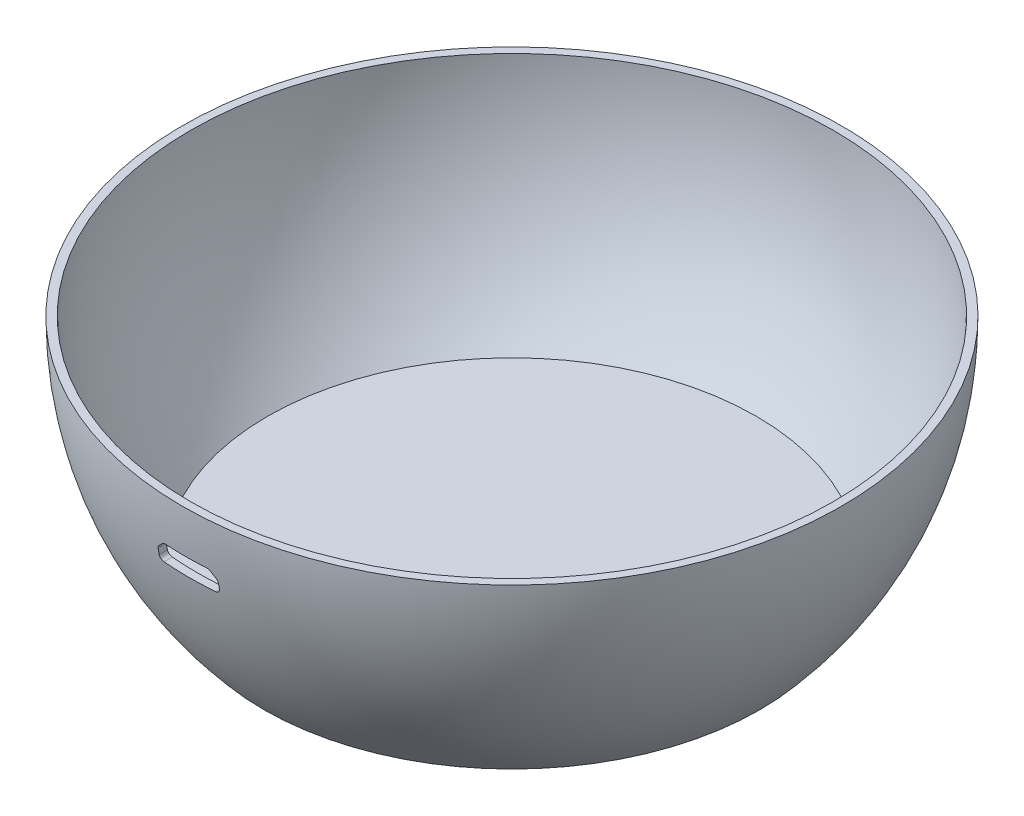
ISO-10303-21;
HEADER;
FILE_DESCRIPTION(('STEP AP214'),'2;1');
FILE_NAME('part.step','',(''),(''),'','','');
FILE_SCHEMA(('AUTOMOTIVE_DESIGN { 1 0 10303 214 1 1 1 1 }'));
ENDSEC;
DATA;
#1=APPLICATION_CONTEXT('core data for automotive mechanical design processes');
#2=APPLICATION_PROTOCOL_DEFINITION('international standard','automotive_design',2000,#1);
#3=PRODUCT_CONTEXT('',#1,'mechanical');
#4=PRODUCT('Part','Part','',(#3));
#5=PRODUCT_RELATED_PRODUCT_CATEGORY('part','',(#4));
#6=PRODUCT_DEFINITION_FORMATION('','',#4);
#7=PRODUCT_DEFINITION_CONTEXT('part definition',#1,'design');
#8=PRODUCT_DEFINITION('design','',#6,#7);
#9=PRODUCT_DEFINITION_SHAPE('','',#8);
#10=(LENGTH_UNIT() NAMED_UNIT(*) SI_UNIT(.MILLI.,.METRE.));
#11=(NAMED_UNIT(*) PLANE_ANGLE_UNIT() SI_UNIT($,.RADIAN.));
#12=(NAMED_UNIT(*) SI_UNIT($,.STERADIAN.) SOLID_ANGLE_UNIT());
#13=UNCERTAINTY_MEASURE_WITH_UNIT(LENGTH_MEASURE(1.E-05),#10,'distance_accuracy_value','');
#14=(GEOMETRIC_REPRESENTATION_CONTEXT(3) GLOBAL_UNCERTAINTY_ASSIGNED_CONTEXT((#13)) GLOBAL_UNIT_ASSIGNED_CONTEXT((#10,
#11,#12)) REPRESENTATION_CONTEXT('',''));
#15=CARTESIAN_POINT('',(0.,0.,0.));
#16=DIRECTION('',(0.,0.,1.));
#17=DIRECTION('',(1.,0.,0.));
#18=AXIS2_PLACEMENT_3D('',#15,#16,#17);
#19=CARTESIAN_POINT('',(41.,0.,0.));
#20=DIRECTION('',(0.,1.,0.));
#21=DIRECTION('',(-1.,0.,0.));
#22=AXIS2_PLACEMENT_3D('',#19,#20,#21);
#23=SPHERICAL_SURFACE('',#22,41.);
#24=CARTESIAN_POINT('',(41.,-27.,0.));
#25=DIRECTION('',(0.,1.,0.));
#26=DIRECTION('',(0.,0.,1.));
#27=AXIS2_PLACEMENT_3D('',#24,#25,#26);
#28=CIRCLE('',#27,30.854497241083);
#29=CARTESIAN_POINT('',(41.,-27.,30.854497241083));
#30=VERTEX_POINT('',#29);
#31=EDGE_CURVE('E363',#30,#30,#28,.T.);
#32=ORIENTED_EDGE('',*,*,#31,.T.);
#33=EDGE_LOOP('',(#32));
#34=FACE_BOUND('',#33,.T.);
#35=CARTESIAN_POINT('',(41.,0.,0.));
#36=DIRECTION('',(0.,1.,0.));
#37=DIRECTION('',(0.,0.,1.));
#38=AXIS2_PLACEMENT_3D('',#35,#36,#37);
#39=CIRCLE('',#38,41.);
#40=CARTESIAN_POINT('',(41.,0.,41.));
#41=VERTEX_POINT('',#40);
#42=EDGE_CURVE('E366',#41,#41,#39,.T.);
#43=ORIENTED_EDGE('',*,*,#42,.F.);
#44=EDGE_LOOP('',(#43));
#45=FACE_BOUND('',#44,.T.);
#46=CARTESIAN_POINT('',(41.,-8.05000000000004,0.));
#47=DIRECTION('',(0.,1.,0.));
#48=DIRECTION('',(0.,0.,1.));
#49=AXIS2_PLACEMENT_3D('',#46,#47,#48);
#50=CIRCLE('',#49,40.201958907496);
#51=CARTESIAN_POINT('',(44.2,-8.05000000000004,40.0743995588206));
#52=VERTEX_POINT('',#51);
#53=CARTESIAN_POINT('',(37.8,-8.05000000000004,40.0743995588206));
#54=VERTEX_POINT('',#53);
#55=EDGE_CURVE('E151',#52,#54,#50,.F.);
#56=ORIENTED_EDGE('',*,*,#55,.T.);
#57=CARTESIAN_POINT('',(37.8002,-8.0499999636364,40.0744155359184));
#58=CARTESIAN_POINT('',(37.7699003872346,-8.05003927033095,40.0719886759873));
#59=CARTESIAN_POINT('',(37.7395654459079,-8.04751966404724,40.0700377498065));
#60=CARTESIAN_POINT('',(37.6796967025583,-8.03753049269013,40.0671262314842));
#61=CARTESIAN_POINT('',(37.6501622961585,-8.03006477660709,40.0661648707617));
#62=CARTESIAN_POINT('',(37.5926974192663,-8.01034419126982,40.0652667607826));
#63=CARTESIAN_POINT('',(37.5647680376586,-7.99808611375659,40.065330699065));
#64=CARTESIAN_POINT('',(37.5113375258054,-7.96914427226676,40.0664809593562));
#65=CARTESIAN_POINT('',(37.4858358657683,-7.9524614769006,40.0675670577373));
#66=CARTESIAN_POINT('',(37.4380163424505,-7.9151929279918,40.0707238905891));
#67=CARTESIAN_POINT('',(37.4156923778877,-7.89461483559452,40.072792704144));
#68=CARTESIAN_POINT('',(37.3747693799187,-7.85013199014316,40.0778498742404));
#69=CARTESIAN_POINT('',(37.3561709913952,-7.82622666236918,40.0808383897522));
#70=CARTESIAN_POINT('',(37.3230273252335,-7.77554102192634,40.0876760527914));
#71=CARTESIAN_POINT('',(37.3085220231873,-7.74873566840783,40.0915330687485));
#72=CARTESIAN_POINT('',(37.2841577634807,-7.69319870225463,40.0999768943745));
#73=CARTESIAN_POINT('',(37.2742980399401,-7.66446740802749,40.1045635835808));
#74=CARTESIAN_POINT('',(37.2612506157921,-7.61301580676833,40.1131434877442));
#75=CARTESIAN_POINT('',(37.2570238596645,-7.59053121811446,40.1170101116611));
#76=CARTESIAN_POINT('',(37.2513938533629,-7.54529259469726,40.125017731459));
#77=CARTESIAN_POINT('',(37.2499866105246,-7.52253898691445,40.1291583307665));
#78=CARTESIAN_POINT('',(37.2500000363636,-7.49980000000001,40.1334087791297));
#79=B_SPLINE_CURVE_WITH_KNOTS('',3,(#57,#58,#59,#60,#61,#62,#63,#64,#65,#66,#67,#68,#69,#70,#71,
#72,#73,#74,#75,#76,#77,#78),.UNSPECIFIED.,.F.,.F.,(4,2,2,2,2,2,2,2,2,2,4),(0.,
0.0910756737535569,0.182080556866536,0.27314646804892,0.364192460516308,0.455061212949634,
0.545945680845675,0.637689271313235,0.729417731435952,0.798858089795699,0.868200045160609),.UNSPECIFIED.);
#80=CARTESIAN_POINT('',(37.25,-7.50000000000001,40.1333714008679));
#81=VERTEX_POINT('',#80);
#82=EDGE_CURVE('E143',#54,#81,#79,.T.);
#83=ORIENTED_EDGE('',*,*,#82,.T.);
#84=CARTESIAN_POINT('',(37.25,0.,0.));
#85=DIRECTION('',(1.,0.,0.));
#86=DIRECTION('',(0.,0.,-1.));
#87=AXIS2_PLACEMENT_3D('',#84,#85,#86);
#88=CIRCLE('',#87,40.8281459290034);
#89=CARTESIAN_POINT('',(37.25,-6.75355338866211,40.2657052170515));
#90=VERTEX_POINT('',#89);
#91=EDGE_CURVE('E131',#81,#90,#88,.F.);
#92=ORIENTED_EDGE('',*,*,#91,.T.);
#93=CARTESIAN_POINT('',(37.2500000363636,-6.75375338866211,40.2656716749872));
#94=CARTESIAN_POINT('',(37.2499634855906,-6.72229697884157,40.2709448389459));
#95=CARTESIAN_POINT('',(37.2526737931118,-6.6908862353088,40.2764275156635));
#96=CARTESIAN_POINT('',(37.2633766203348,-6.62899532754217,40.2876541457646));
#97=CARTESIAN_POINT('',(37.2713736849618,-6.59851598762657,40.2933983199927));
#98=CARTESIAN_POINT('',(37.2924429677611,-6.53936989039266,40.3049833752062));
#99=CARTESIAN_POINT('',(37.3055176529426,-6.51070402205149,40.3108243018771));
#100=CARTESIAN_POINT('',(37.3363421689391,-6.45606266603959,40.3224240193953));
#101=CARTESIAN_POINT('',(37.3540817361135,-6.43008144431934,40.3281829616562));
#102=CARTESIAN_POINT('',(37.3856509342431,-6.3913881029512,40.3371664765541));
#103=CARTESIAN_POINT('',(37.3981335658757,-6.37757907384953,40.3404686151327));
#104=CARTESIAN_POINT('',(37.4112912703474,-6.36444476374105,40.3437109411492));
#105=B_SPLINE_CURVE_WITH_KNOTS('',3,(#93,#94,#95,#96,#97,#98,#99,#100,#101,#102,#103,#104),
.UNSPECIFIED.,.F.,.F.,(4,2,2,2,2,4),(0.,0.0955538810140487,0.191190014903938,0.286872672750666,
0.382346546537081,0.438964350776908),.UNSPECIFIED.);
#106=CARTESIAN_POINT('',(37.4110912703474,-6.36464466094061,40.3436616145608));
#107=VERTEX_POINT('',#106);
#108=EDGE_CURVE('E137',#90,#107,#105,.T.);
#109=ORIENTED_EDGE('',*,*,#108,.T.);
#110=CARTESIAN_POINT('',(42.387867965644,-1.387867965644,0.));
#111=DIRECTION('',(0.707106781186548,-0.707106781186547,0.));
#112=DIRECTION('',(0.707106781186547,0.707106781186548,0.));
#113=AXIS2_PLACEMENT_3D('',#110,#111,#112);
#114=CIRCLE('',#113,40.9529931142997);
#115=CARTESIAN_POINT('',(38.0146446609406,-5.76109127034741,40.4832987894302));
#116=VERTEX_POINT('',#115);
#117=EDGE_CURVE('E291',#107,#116,#114,.F.);
#118=ORIENTED_EDGE('',*,*,#117,.T.);
#119=CARTESIAN_POINT('',(38.0144446609406,-5.76129137325223,40.4832555636266));
#120=CARTESIAN_POINT('',(38.0362805035121,-5.7393949171051,40.4879824483503));
#121=CARTESIAN_POINT('',(38.0600161259931,-5.71936072479655,40.4925474023299));
#122=CARTESIAN_POINT('',(38.1105939624342,-5.68349272079399,40.5012372161063));
#123=CARTESIAN_POINT('',(38.1374402771385,-5.66766454636847,40.5053614808737));
#124=CARTESIAN_POINT('',(38.1935122165427,-5.64073215551732,40.5130442329548));
#125=CARTESIAN_POINT('',(38.2227401754652,-5.62963264158155,40.5166021548685));
#126=CARTESIAN_POINT('',(38.2826750991061,-5.61254778446806,40.52303578879));
#127=CARTESIAN_POINT('',(38.3133784241999,-5.60655047630228,40.5259130853921));
#128=CARTESIAN_POINT('',(38.3542197014463,-5.60212661564787,40.5292008763934));
#129=CARTESIAN_POINT('',(38.364111277904,-5.6013260462963,40.5299560383406));
#130=CARTESIAN_POINT('',(38.3839174823874,-5.60026155923667,40.5313863710729));
#131=CARTESIAN_POINT('',(38.393832070418,-5.59999702072795,40.5320616335384));
#132=CARTESIAN_POINT('',(38.4037533905932,-5.60000003636364,40.5326967167973));
#133=B_SPLINE_CURVE_WITH_KNOTS('',3,(#119,#120,#121,#122,#123,#124,#125,#126,#127,#128,#129,
#130,#131,#132),.UNSPECIFIED.,.F.,.F.,(4,2,2,2,2,2,4),(0.,0.0937391784444169,0.187603367684721,
0.281560684957384,0.375297054343548,0.405144355238499,0.434957068871828),.UNSPECIFIED.);
#134=CARTESIAN_POINT('',(38.4035533905932,-5.60000000000001,40.5326839106973));
#135=VERTEX_POINT('',#134);
#136=EDGE_CURVE('E283',#116,#135,#133,.T.);
#137=ORIENTED_EDGE('',*,*,#136,.T.);
#138=CARTESIAN_POINT('',(41.,-5.60000000000001,0.));
#139=DIRECTION('',(0.,-1.,0.));
#140=DIRECTION('',(0.,0.,-1.));
#141=AXIS2_PLACEMENT_3D('',#138,#139,#140);
#142=CIRCLE('',#141,40.6157604877713);
#143=CARTESIAN_POINT('',(43.5964466094068,-5.60000000000001,40.5326839106973));
#144=VERTEX_POINT('',#143);
#145=EDGE_CURVE('E279',#135,#144,#142,.F.);
#146=ORIENTED_EDGE('',*,*,#145,.T.);
#147=CARTESIAN_POINT('',(43.5962466094068,-5.60000003636364,40.5326967167973));
#148=CARTESIAN_POINT('',(43.6271758240302,-5.59996097763576,40.5307213701466));
#149=CARTESIAN_POINT('',(43.6580681745533,-5.60258428373273,40.5283442977183));
#150=CARTESIAN_POINT('',(43.7189258241249,-5.61293109130712,40.5228750061427));
#151=CARTESIAN_POINT('',(43.7488910626392,-5.62065492508332,40.5197827404093));
#152=CARTESIAN_POINT('',(43.8070474097332,-5.64098186960747,40.5129704177915));
#153=CARTESIAN_POINT('',(43.8352378737688,-5.65358674125126,40.5092501346155));
#154=CARTESIAN_POINT('',(43.8890307940233,-5.6832724891185,40.5012946794562));
#155=CARTESIAN_POINT('',(43.9146376753362,-5.70034552566158,40.4970604161927));
#156=CARTESIAN_POINT('',(43.9468296283883,-5.72592114773363,40.4911118101072));
#157=CARTESIAN_POINT('',(43.9548664943422,-5.73269221380947,40.489568002625));
#158=CARTESIAN_POINT('',(43.9705237507168,-5.74666894499008,40.4864409002204));
#159=CARTESIAN_POINT('',(43.9781447228812,-5.75387397175067,40.4848576652142));
#160=CARTESIAN_POINT('',(43.9855553390594,-5.76129137325224,40.4832555636266));
#161=B_SPLINE_CURVE_WITH_KNOTS('',3,(#147,#148,#149,#150,#151,#152,#153,#154,#155,#156,#157,
#158,#159,#160),.UNSPECIFIED.,.F.,.F.,(4,2,2,2,2,2,4),(0.,0.0928458685862995,0.185697786666968,
0.278583233500037,0.371306786955016,0.403159509972959,0.434966471618371),.UNSPECIFIED.);
#162=CARTESIAN_POINT('',(43.9853553390594,-5.76109127034741,40.4832987894302));
#163=VERTEX_POINT('',#162);
#164=EDGE_CURVE('E271',#144,#163,#161,.T.);
#165=ORIENTED_EDGE('',*,*,#164,.T.);
#166=CARTESIAN_POINT('',(39.612132034356,-1.387867965644,0.));
#167=DIRECTION('',(-0.707106781186548,-0.707106781186547,0.));
#168=DIRECTION('',(0.707106781186547,-0.707106781186548,0.));
#169=AXIS2_PLACEMENT_3D('',#166,#167,#168);
#170=CIRCLE('',#169,40.9529931142997);
#171=CARTESIAN_POINT('',(44.5889087296526,-6.36464466094061,40.3436616145608));
#172=VERTEX_POINT('',#171);
#173=EDGE_CURVE('E253',#163,#172,#170,.F.);
#174=ORIENTED_EDGE('',*,*,#173,.T.);
#175=CARTESIAN_POINT('',(44.5887087296526,-6.36444476374106,40.3437109411492));
#176=CARTESIAN_POINT('',(44.6109809542131,-6.38665870125118,40.3382257715706));
#177=CARTESIAN_POINT('',(44.6312844000374,-6.41078841558891,40.332574844841));
#178=CARTESIAN_POINT('',(44.6675056965239,-6.46214461266667,40.3210999542107));
#179=CARTESIAN_POINT('',(44.6834190889391,-6.48937420409453,40.3152758210117));
#180=CARTESIAN_POINT('',(44.710372847714,-6.54616329097255,40.3036214861078));
#181=CARTESIAN_POINT('',(44.7214104705602,-6.57572408715638,40.2977912828318));
#182=CARTESIAN_POINT('',(44.7382625282888,-6.63626720216154,40.2863049458101));
#183=CARTESIAN_POINT('',(44.7440886805733,-6.66724616656255,40.2806484493203));
#184=CARTESIAN_POINT('',(44.7490871752098,-6.7168555971351,40.2719325391708));
#185=CARTESIAN_POINT('',(44.750013605075,-6.73530319986966,40.2687651561229));
#186=CARTESIAN_POINT('',(44.7499999636364,-6.75375338866211,40.2656716749872));
#187=B_SPLINE_CURVE_WITH_KNOTS('',3,(#175,#176,#177,#178,#179,#180,#181,#182,#183,#184,#185,
#186),.UNSPECIFIED.,.F.,.F.,(4,2,2,2,2,4),(0.,0.0956639887729292,0.191424772883727,
0.287239371553348,0.382837996464172,0.43896347289525),.UNSPECIFIED.);
#188=CARTESIAN_POINT('',(44.75,-6.75355338866211,40.2657052170515));
#189=VERTEX_POINT('',#188);
#190=EDGE_CURVE('E245',#172,#189,#187,.T.);
#191=ORIENTED_EDGE('',*,*,#190,.T.);
#192=CARTESIAN_POINT('',(44.75,0.,0.));
#193=DIRECTION('',(-1.,0.,0.));
#194=DIRECTION('',(0.,0.,1.));
#195=AXIS2_PLACEMENT_3D('',#192,#193,#194);
#196=CIRCLE('',#195,40.8281459290034);
#197=CARTESIAN_POINT('',(44.75,-7.50000000000001,40.1333714008679));
#198=VERTEX_POINT('',#197);
#199=EDGE_CURVE('E241',#189,#198,#196,.F.);
#200=ORIENTED_EDGE('',*,*,#199,.T.);
#201=CARTESIAN_POINT('',(44.7499999636364,-7.49980000000001,40.1334087791297));
#202=CARTESIAN_POINT('',(44.7500366289958,-7.53073763439805,40.1276243635534));
#203=CARTESIAN_POINT('',(44.747413235002,-7.56171566514907,40.1220431822736));
#204=CARTESIAN_POINT('',(44.7369861529067,-7.62288652050409,40.1114387465349));
#205=CARTESIAN_POINT('',(44.7291822538434,-7.6530793130794,40.1064155148067));
#206=CARTESIAN_POINT('',(44.7085243142431,-7.71183859933012,40.0970745498822));
#207=CARTESIAN_POINT('',(44.6956655397573,-7.74040353970812,40.0927574834003));
#208=CARTESIAN_POINT('',(44.6652339410104,-7.79501423049603,40.0849698076941));
#209=CARTESIAN_POINT('',(44.6476632419669,-7.82106110943842,40.0814988182079));
#210=CARTESIAN_POINT('',(44.6085658857173,-7.86949799719823,40.0755563545395));
#211=CARTESIAN_POINT('',(44.5871000435364,-7.89193539783009,40.0730711656129));
#212=CARTESIAN_POINT('',(44.5406428015268,-7.93292237863274,40.069109727406));
#213=CARTESIAN_POINT('',(44.5156510034158,-7.95147151900722,40.0676335922159));
#214=CARTESIAN_POINT('',(44.4633153569412,-7.98383495727223,40.0657554307062));
#215=CARTESIAN_POINT('',(44.436017748413,-7.99772314176654,40.0653358814598));
#216=CARTESIAN_POINT('',(44.3795056255033,-8.02077591421093,40.0655341322657));
#217=CARTESIAN_POINT('',(44.3502921679249,-8.0299430820252,40.0661513649666));
#218=CARTESIAN_POINT('',(44.3007205298243,-8.04108194746364,40.068025405947));
#219=CARTESIAN_POINT('',(44.280649973378,-8.04443288706456,40.0690010907152));
#220=CARTESIAN_POINT('',(44.2403163976394,-8.04889557957248,40.0713868324811));
#221=CARTESIAN_POINT('',(44.2200536989173,-8.05001056603265,40.0727962588078));
#222=CARTESIAN_POINT('',(44.1998,-8.0499999636364,40.0744155359184));
#223=B_SPLINE_CURVE_WITH_KNOTS('',3,(#201,#202,#203,#204,#205,#206,#207,#208,#209,#210,#211,
#212,#213,#214,#215,#216,#217,#218,#219,#220,#221,#222),.UNSPECIFIED.,.F.,.F.,(4,2,2,2,2,2,2,2,
2,2,4),(0.,0.0943132650198575,0.18863037092288,0.283036017113404,0.377399154964621,
0.470399112807413,0.563409584091393,0.654867053883511,0.746274492315015,0.807269312488723,
0.868175860401324),.UNSPECIFIED.);
#224=EDGE_CURVE('E160',#198,#52,#223,.T.);
#225=ORIENTED_EDGE('',*,*,#224,.T.);
#226=EDGE_LOOP('',(#56,#83,#92,#109,#118,#137,#146,#165,#174,#191,#200,#225));
#227=FACE_BOUND('',#226,.T.);
#228=ADVANCED_FACE('F39',(#34,#45,#227),#23,.T.);
#229=CARTESIAN_POINT('',(41.,0.,0.));
#230=DIRECTION('',(0.,1.,0.));
#231=DIRECTION('',(-1.,0.,0.));
#232=AXIS2_PLACEMENT_3D('',#229,#230,#231);
#233=SPHERICAL_SURFACE('',#232,40.);
#234=CARTESIAN_POINT('',(41.,0.,0.));
#235=DIRECTION('',(0.,1.,0.));
#236=DIRECTION('',(0.,0.,1.));
#237=AXIS2_PLACEMENT_3D('',#234,#235,#236);
#238=CIRCLE('',#237,40.);
#239=CARTESIAN_POINT('',(41.,0.,40.));
#240=VERTEX_POINT('',#239);
#241=EDGE_CURVE('E153',#240,#240,#238,.T.);
#242=ORIENTED_EDGE('',*,*,#241,.T.);
#243=EDGE_LOOP('',(#242));
#244=FACE_BOUND('',#243,.T.);
#245=CARTESIAN_POINT('',(41.,-26.,0.));
#246=DIRECTION('',(0.,-1.,0.));
#247=DIRECTION('',(0.,0.,-1.));
#248=AXIS2_PLACEMENT_3D('',#245,#246,#247);
#249=CIRCLE('',#248,30.3973683071413);
#250=CARTESIAN_POINT('',(41.,-26.,-30.3973683071413));
#251=VERTEX_POINT('',#250);
#252=EDGE_CURVE('E158',#251,#251,#249,.F.);
#253=ORIENTED_EDGE('',*,*,#252,.F.);
#254=EDGE_LOOP('',(#253));
#255=FACE_BOUND('',#254,.T.);
#256=CARTESIAN_POINT('',(37.8002,-8.0499999636364,39.0507206149317));
#257=CARTESIAN_POINT('',(37.7699334565426,-8.05003935197738,39.0482328284918));
#258=CARTESIAN_POINT('',(37.7396294446605,-8.04752509803339,39.0462322564797));
#259=CARTESIAN_POINT('',(37.6798176566715,-8.03755585029134,39.0432452332238));
#260=CARTESIAN_POINT('',(37.6503092806977,-8.03010469358013,39.0422579959082));
#261=CARTESIAN_POINT('',(37.5928907769857,-8.01042104109833,39.0413330376611));
#262=CARTESIAN_POINT('',(37.5649817508803,-7.99818529402809,39.0413960316138));
#263=CARTESIAN_POINT('',(37.5115863455905,-7.9692954771769,39.042569342386));
#264=CARTESIAN_POINT('',(37.4860994321111,-7.9526423849074,39.0436794276342));
#265=CARTESIAN_POINT('',(37.4383055224072,-7.91544248278593,39.0469079525823));
#266=CARTESIAN_POINT('',(37.4159920985901,-7.89490374548719,39.049024315263));
#267=CARTESIAN_POINT('',(37.3750813745428,-7.85050746596123,39.0541984358679));
#268=CARTESIAN_POINT('',(37.3564847137637,-7.82664935384705,39.0572563555529));
#269=CARTESIAN_POINT('',(37.3233256237654,-7.77605378950541,39.0642546258677));
#270=CARTESIAN_POINT('',(37.3088050139484,-7.7492901385213,39.0682034236561));
#271=CARTESIAN_POINT('',(37.2844000711955,-7.69383963880281,39.0768484464793));
#272=CARTESIAN_POINT('',(37.2745150705416,-7.66515306772863,39.0815445637388));
#273=CARTESIAN_POINT('',(37.2613741747397,-7.61362915827657,39.090355227674));
#274=CARTESIAN_POINT('',(37.2571008507733,-7.59102311663479,39.0943425008399));
#275=CARTESIAN_POINT('',(37.2514089888463,-7.54553905613564,39.1026015622009));
#276=CARTESIAN_POINT('',(37.2499864125488,-7.52266146825965,39.1068729390568));
#277=CARTESIAN_POINT('',(37.2500000363636,-7.49980000000001,39.1112579730278));
#278=B_SPLINE_CURVE_WITH_KNOTS('',3,(#256,#257,#258,#259,#260,#261,#262,#263,#264,#265,#266,
#267,#268,#269,#270,#271,#272,#273,#274,#275,#276,#277),.UNSPECIFIED.,.F.,.F.,(4,2,2,2,2,2,2,2,
2,2,4),(0.,0.0909920433011582,0.181913448092945,0.272896744888789,0.363859924822316,
0.454636160792707,0.545428000959509,0.637119873345361,0.728798534278419,0.798675398550316,
0.868453205876487),.UNSPECIFIED.);
#279=CARTESIAN_POINT('',(37.8,-8.05000000000004,39.0507042190023));
#280=VERTEX_POINT('',#279);
#281=CARTESIAN_POINT('',(37.25,-7.50000000000001,39.111219617905));
#282=VERTEX_POINT('',#281);
#283=EDGE_CURVE('E11',#280,#282,#278,.T.);
#284=ORIENTED_EDGE('',*,*,#283,.F.);
#285=CARTESIAN_POINT('',(41.,-8.05000000000004,0.));
#286=DIRECTION('',(0.,1.,0.));
#287=DIRECTION('',(0.,0.,1.));
#288=AXIS2_PLACEMENT_3D('',#285,#286,#287);
#289=CIRCLE('',#288,39.1815964452701);
#290=CARTESIAN_POINT('',(44.2,-8.05000000000004,39.0507042190023));
#291=VERTEX_POINT('',#290);
#292=EDGE_CURVE('E54',#291,#280,#289,.F.);
#293=ORIENTED_EDGE('',*,*,#292,.F.);
#294=CARTESIAN_POINT('',(44.7499999636364,-7.49980000000001,39.1112579730278));
#295=CARTESIAN_POINT('',(44.7500365756864,-7.53073818665747,39.1053222852852));
#296=CARTESIAN_POINT('',(44.7474131197945,-7.56171917094906,39.0995946117988));
#297=CARTESIAN_POINT('',(44.7369830896111,-7.62290168330867,39.0887107992281));
#298=CARTESIAN_POINT('',(44.7291760752281,-7.65310314496792,39.0835547087153));
#299=CARTESIAN_POINT('',(44.708506043345,-7.71188428651938,39.0739660166642));
#300=CARTESIAN_POINT('',(44.6956381666891,-7.74046237747272,39.0695341162584));
#301=CARTESIAN_POINT('',(44.6651806006698,-7.79510022122182,39.0615393554536));
#302=CARTESIAN_POINT('',(44.6475931099616,-7.82116113898655,39.0579760918671));
#303=CARTESIAN_POINT('',(44.6084690225527,-7.86960499096648,39.0518787332809));
#304=CARTESIAN_POINT('',(44.586996554731,-7.89203783454941,39.0493298101549));
#305=CARTESIAN_POINT('',(44.54052382459,-7.9330161622317,39.0452674372943));
#306=CARTESIAN_POINT('',(44.5155231797882,-7.95156122432199,39.0437540999296));
#307=CARTESIAN_POINT('',(44.4631922116895,-7.98390057323032,39.0418309274137));
#308=CARTESIAN_POINT('',(44.4359105666481,-7.99777264196794,39.0414021617429));
#309=CARTESIAN_POINT('',(44.3794339965957,-8.02079934619896,39.0416077057543));
#310=CARTESIAN_POINT('',(44.3502401227991,-8.02995654947694,39.0422414359835));
#311=CARTESIAN_POINT('',(44.300693628074,-8.04108680529185,39.0441642152056));
#312=CARTESIAN_POINT('',(44.2806273280637,-8.0444360434735,39.0451654635073));
#313=CARTESIAN_POINT('',(44.2403038311819,-8.04889631842659,39.0476133981359));
#314=CARTESIAN_POINT('',(44.220046953171,-8.05001059239152,39.0490594367054));
#315=CARTESIAN_POINT('',(44.1998,-8.0499999636364,39.0507206149317));
#316=B_SPLINE_CURVE_WITH_KNOTS('',3,(#294,#295,#296,#297,#298,#299,#300,#301,#302,#303,#304,
#305,#306,#307,#308,#309,#310,#311,#312,#313,#314,#315),.UNSPECIFIED.,.F.,.F.,(4,2,2,2,2,2,2,2,
2,2,4),(0.,0.0944001411977285,0.188808298124544,0.283307322627056,0.377762400493495,
0.47078093848976,0.563809568195922,0.655202873513271,0.746546351912743,0.807531327817181,
0.868427907163245),.UNSPECIFIED.);
#317=CARTESIAN_POINT('',(44.75,-7.50000000000001,39.111219617905));
#318=VERTEX_POINT('',#317);
#319=EDGE_CURVE('E221',#318,#291,#316,.T.);
#320=ORIENTED_EDGE('',*,*,#319,.F.);
#321=CARTESIAN_POINT('',(44.75,0.,0.));
#322=DIRECTION('',(-1.,0.,0.));
#323=DIRECTION('',(0.,0.,1.));
#324=AXIS2_PLACEMENT_3D('',#321,#322,#323);
#325=CIRCLE('',#324,39.823830805185);
#326=CARTESIAN_POINT('',(44.75,-6.75355338866211,39.2470000971602));
#327=VERTEX_POINT('',#326);
#328=EDGE_CURVE('E227',#327,#318,#325,.F.);
#329=ORIENTED_EDGE('',*,*,#328,.F.);
#330=CARTESIAN_POINT('',(44.5887087296526,-6.36444476374106,39.327026489464));
#331=CARTESIAN_POINT('',(44.6110006528483,-6.38667852984986,39.3213945117502));
#332=CARTESIAN_POINT('',(44.6313193820633,-6.41083013842336,39.3155924286532));
#333=CARTESIAN_POINT('',(44.6675630200207,-6.46223373124742,39.303810663085));
#334=CARTESIAN_POINT('',(44.6834833871918,-6.48948887939734,39.2978308040517));
#335=CARTESIAN_POINT('',(44.7104425733899,-6.5463311633723,39.2858650539672));
#336=CARTESIAN_POINT('',(44.721478672947,-6.57591958754843,39.279879161411));
#337=CARTESIAN_POINT('',(44.7383189279224,-6.63651947682262,39.2680862723922));
#338=CARTESIAN_POINT('',(44.7441348775946,-6.66752756678204,39.2622789014237));
#339=CARTESIAN_POINT('',(44.7490974829559,-6.71706338710927,39.2533524461497));
#340=CARTESIAN_POINT('',(44.7500134452787,-6.73540683581407,39.2501216408446));
#341=CARTESIAN_POINT('',(44.7499999636364,-6.75375338866211,39.2469656844687));
#342=B_SPLINE_CURVE_WITH_KNOTS('',3,(#330,#331,#332,#333,#334,#335,#336,#337,#338,#339,#340,
#341),.UNSPECIFIED.,.F.,.F.,(4,2,2,2,2,4),(0.,0.0958227826325578,0.191744141325106,
0.287718840274151,0.383476146934605,0.439326818036652),.UNSPECIFIED.);
#343=CARTESIAN_POINT('',(44.5889087296526,-6.36464466094061,39.3269758876803));
#344=VERTEX_POINT('',#343);
#345=EDGE_CURVE('E213',#344,#327,#342,.T.);
#346=ORIENTED_EDGE('',*,*,#345,.F.);
#347=CARTESIAN_POINT('',(39.612132034356,-1.387867965644,0.));
#348=DIRECTION('',(-0.707106781186548,-0.707106781186547,0.));
#349=DIRECTION('',(0.707106781186547,-0.707106781186548,0.));
#350=AXIS2_PLACEMENT_3D('',#347,#348,#349);
#351=CIRCLE('',#350,39.9518165421784);
#352=CARTESIAN_POINT('',(43.9853553390594,-5.76109127034741,39.4702100434527));
#353=VERTEX_POINT('',#352);
#354=EDGE_CURVE('E505',#353,#344,#351,.F.);
#355=ORIENTED_EDGE('',*,*,#354,.F.);
#356=CARTESIAN_POINT('',(43.5962466094068,-5.60000003636364,39.5208742708948));
#357=CARTESIAN_POINT('',(43.6271764396294,-5.59996096307181,39.5188483124232));
#358=CARTESIAN_POINT('',(43.6580677476316,-5.60258437468635,39.5164104264611));
#359=CARTESIAN_POINT('',(43.7189193757208,-5.61292983298187,39.510801663834));
#360=CARTESIAN_POINT('',(43.7488796642449,-5.62065205232224,39.5076307623494));
#361=CARTESIAN_POINT('',(43.8070231234021,-5.64097226657588,39.5006457782533));
#362=CARTESIAN_POINT('',(43.8352056776022,-5.6535719420659,39.4968314742068));
#363=CARTESIAN_POINT('',(43.8889822848778,-5.6832427667675,39.4886754526371));
#364=CARTESIAN_POINT('',(43.9145807264423,-5.70030615217274,39.4843346578112));
#365=CARTESIAN_POINT('',(43.9467769798283,-5.72587730259119,39.4782338566423));
#366=CARTESIAN_POINT('',(43.9548253098367,-5.73265649660712,39.4766484185484));
#367=CARTESIAN_POINT('',(43.9705041496241,-5.74665040939282,39.4734369756981));
#368=CARTESIAN_POINT('',(43.9781352459354,-5.75386448515041,39.4718110328237));
#369=CARTESIAN_POINT('',(43.9855553390594,-5.76129137325223,39.4701657081637));
#370=B_SPLINE_CURVE_WITH_KNOTS('',3,(#356,#357,#358,#359,#360,#361,#362,#363,#364,#365,#366,
#367,#368,#369),.UNSPECIFIED.,.F.,.F.,(4,2,2,2,2,2,4),(0.,0.0928568915598735,0.185716927666158,
0.278608988155211,0.371340541917119,0.403253145067145,0.435119667898958),.UNSPECIFIED.);
#371=CARTESIAN_POINT('',(43.5964466094068,-5.60000000000001,39.52086113693));
#372=VERTEX_POINT('',#371);
#373=EDGE_CURVE('E205',#372,#353,#370,.T.);
#374=ORIENTED_EDGE('',*,*,#373,.F.);
#375=CARTESIAN_POINT('',(41.,-5.60000000000001,0.));
#376=DIRECTION('',(0.,-1.,0.));
#377=DIRECTION('',(0.,0.,-1.));
#378=AXIS2_PLACEMENT_3D('',#375,#376,#377);
#379=CIRCLE('',#378,39.606060142357);
#380=CARTESIAN_POINT('',(38.4035533905932,-5.60000000000001,39.52086113693));
#381=VERTEX_POINT('',#380);
#382=EDGE_CURVE('E499',#381,#372,#379,.F.);
#383=ORIENTED_EDGE('',*,*,#382,.F.);
#384=CARTESIAN_POINT('',(38.0144446609406,-5.76129137325223,39.4701657081637));
#385=CARTESIAN_POINT('',(38.0362809015633,-5.73939455883776,39.475014002085));
#386=CARTESIAN_POINT('',(38.0600180698064,-5.71935892609328,39.4796964065785));
#387=CARTESIAN_POINT('',(38.1106031086462,-5.68348665181999,39.4886102457897));
#388=CARTESIAN_POINT('',(38.1374551883212,-5.66765578929644,39.4928410551133));
#389=CARTESIAN_POINT('',(38.1935434752765,-5.64071874369897,39.5007225388666));
#390=CARTESIAN_POINT('',(38.2227820591051,-5.62961734047571,39.5043726240621));
#391=CARTESIAN_POINT('',(38.282742031016,-5.61253205719945,39.5109727936005));
#392=CARTESIAN_POINT('',(38.3134597441846,-5.60653612210179,39.5139245149431));
#393=CARTESIAN_POINT('',(38.3543004009727,-5.60211965530769,39.5172953070576));
#394=CARTESIAN_POINT('',(38.3641756820856,-5.60132171493687,39.5180683259476));
#395=CARTESIAN_POINT('',(38.3839495147802,-5.60026070801144,39.5195326135888));
#396=CARTESIAN_POINT('',(38.3938480264533,-5.59999702639247,39.5202239754825));
#397=CARTESIAN_POINT('',(38.4037533905932,-5.60000003636364,39.5208742708948));
#398=B_SPLINE_CURVE_WITH_KNOTS('',3,(#384,#385,#386,#387,#388,#389,#390,#391,#392,#393,#394,
#395,#396,#397),.UNSPECIFIED.,.F.,.F.,(4,2,2,2,2,2,4),(0.,0.0937970120245939,0.187722278608491,
0.281742247306697,0.375539595280832,0.405341847116972,0.43510976962837),.UNSPECIFIED.);
#399=CARTESIAN_POINT('',(38.0146446609406,-5.76109127034741,39.4702100434527));
#400=VERTEX_POINT('',#399);
#401=EDGE_CURVE('E196',#400,#381,#398,.T.);
#402=ORIENTED_EDGE('',*,*,#401,.F.);
#403=CARTESIAN_POINT('',(42.387867965644,-1.387867965644,0.));
#404=DIRECTION('',(0.707106781186548,-0.707106781186547,0.));
#405=DIRECTION('',(0.707106781186547,0.707106781186548,0.));
#406=AXIS2_PLACEMENT_3D('',#403,#404,#405);
#407=CIRCLE('',#406,39.9518165421784);
#408=CARTESIAN_POINT('',(37.4110912703474,-6.36464466094061,39.3269758876802));
#409=VERTEX_POINT('',#408);
#410=EDGE_CURVE('E359',#409,#400,#407,.F.);
#411=ORIENTED_EDGE('',*,*,#410,.F.);
#412=CARTESIAN_POINT('',(37.2500000363636,-6.75375338866211,39.2469656844687));
#413=CARTESIAN_POINT('',(37.2499635801141,-6.72226909774829,39.2523805283025));
#414=CARTESIAN_POINT('',(37.2526785529241,-6.6908325299412,39.2580102788801));
#415=CARTESIAN_POINT('',(37.2633986238109,-6.62889415172818,39.2695376295519));
#416=CARTESIAN_POINT('',(37.271408324017,-6.59839317868784,39.2754354585007));
#417=CARTESIAN_POINT('',(37.2925094571891,-6.53920901477878,39.2873298304367));
#418=CARTESIAN_POINT('',(37.3056033117354,-6.51052669771951,39.2933264191579));
#419=CARTESIAN_POINT('',(37.3364722575788,-6.45585760169711,39.3052348039082));
#420=CARTESIAN_POINT('',(37.3542370362205,-6.4298650581819,39.3111467568477));
#421=CARTESIAN_POINT('',(37.3857806252738,-6.39124480305045,39.3203479819714));
#422=CARTESIAN_POINT('',(37.3982017751901,-6.37751110369401,39.3237175655957));
#423=CARTESIAN_POINT('',(37.4112912703474,-6.36444476374106,39.327026489464));
#424=B_SPLINE_CURVE_WITH_KNOTS('',3,(#412,#413,#414,#415,#416,#417,#418,#419,#420,#421,#422,
#423),.UNSPECIFIED.,.F.,.F.,(4,2,2,2,2,4),(0.,0.0957069808730428,0.191497258963687,
0.287333217995216,0.382959337784434,0.439327749245331),.UNSPECIFIED.);
#425=CARTESIAN_POINT('',(37.25,-6.75355338866211,39.2470000971602));
#426=VERTEX_POINT('',#425);
#427=EDGE_CURVE('E185',#426,#409,#424,.T.);
#428=ORIENTED_EDGE('',*,*,#427,.F.);
#429=CARTESIAN_POINT('',(37.25,0.,0.));
#430=DIRECTION('',(1.,0.,0.));
#431=DIRECTION('',(0.,0.,-1.));
#432=AXIS2_PLACEMENT_3D('',#429,#430,#431);
#433=CIRCLE('',#432,39.823830805185);
#434=EDGE_CURVE('E357',#282,#426,#433,.F.);
#435=ORIENTED_EDGE('',*,*,#434,.F.);
#436=EDGE_LOOP('',(#284,#293,#320,#329,#346,#355,#374,#383,#402,#411,#428,#435));
#437=FACE_BOUND('',#436,.T.);
#438=ADVANCED_FACE('F174',(#244,#255,#437),#233,.F.);
#439=CARTESIAN_POINT('',(41.,-27.,0.));
#440=DIRECTION('',(0.,-1.,0.));
#441=DIRECTION('',(0.,0.,-1.));
#442=AXIS2_PLACEMENT_3D('',#439,#440,#441);
#443=PLANE('',#442);
#444=ORIENTED_EDGE('',*,*,#31,.F.);
#445=EDGE_LOOP('',(#444));
#446=FACE_BOUND('',#445,.T.);
#447=ADVANCED_FACE('F179',(#446),#443,.T.);
#448=CARTESIAN_POINT('',(0.,0.,0.));
#449=DIRECTION('',(0.,1.,0.));
#450=DIRECTION('',(0.,0.,1.));
#451=AXIS2_PLACEMENT_3D('',#448,#449,#450);
#452=PLANE('',#451);
#453=ORIENTED_EDGE('',*,*,#241,.F.);
#454=EDGE_LOOP('',(#453));
#455=FACE_BOUND('',#454,.T.);
#456=ORIENTED_EDGE('',*,*,#42,.T.);
#457=EDGE_LOOP('',(#456));
#458=FACE_BOUND('',#457,.T.);
#459=ADVANCED_FACE('F379',(#455,#458),#452,.T.);
#460=CARTESIAN_POINT('',(41.,-26.,0.));
#461=DIRECTION('',(0.,-1.,0.));
#462=DIRECTION('',(0.,0.,-1.));
#463=AXIS2_PLACEMENT_3D('',#460,#461,#462);
#464=PLANE('',#463);
#465=ORIENTED_EDGE('',*,*,#252,.T.);
#466=EDGE_LOOP('',(#465));
#467=FACE_BOUND('',#466,.T.);
#468=ADVANCED_FACE('F172',(#467),#464,.F.);
#469=CARTESIAN_POINT('',(37.8,-7.50000000000004,41.));
#470=DIRECTION('',(0.,0.,-1.));
#471=DIRECTION('',(-1.,0.,0.));
#472=AXIS2_PLACEMENT_3D('',#469,#470,#471);
#473=CYLINDRICAL_SURFACE('',#472,0.549999999999995);
#474=DIRECTION('',(0.,0.,-1.));
#475=VECTOR('',#474,1.);
#476=CARTESIAN_POINT('',(37.8,-8.05000000000004,41.));
#477=LINE('',#476,#475);
#478=EDGE_CURVE('E138',#54,#280,#477,.T.);
#479=ORIENTED_EDGE('',*,*,#478,.T.);
#480=ORIENTED_EDGE('',*,*,#283,.T.);
#481=DIRECTION('',(0.,0.,-1.));
#482=VECTOR('',#481,1.);
#483=CARTESIAN_POINT('',(37.25,-7.50000000000001,41.));
#484=LINE('',#483,#482);
#485=EDGE_CURVE('E66',#81,#282,#484,.T.);
#486=ORIENTED_EDGE('',*,*,#485,.F.);
#487=ORIENTED_EDGE('',*,*,#82,.F.);
#488=EDGE_LOOP('',(#479,#480,#486,#487));
#489=FACE_BOUND('',#488,.T.);
#490=ADVANCED_FACE('F142',(#489),#473,.F.);
#491=CARTESIAN_POINT('',(44.2,-8.05000000000004,41.));
#492=DIRECTION('',(0.,1.,0.));
#493=DIRECTION('',(0.,0.,1.));
#494=AXIS2_PLACEMENT_3D('',#491,#492,#493);
#495=PLANE('',#494);
#496=DIRECTION('',(0.,0.,-1.));
#497=VECTOR('',#496,1.);
#498=CARTESIAN_POINT('',(44.2,-8.05000000000004,41.));
#499=LINE('',#498,#497);
#500=EDGE_CURVE('E316',#52,#291,#499,.T.);
#501=ORIENTED_EDGE('',*,*,#500,.T.);
#502=ORIENTED_EDGE('',*,*,#292,.T.);
#503=ORIENTED_EDGE('',*,*,#478,.F.);
#504=ORIENTED_EDGE('',*,*,#55,.F.);
#505=EDGE_LOOP('',(#501,#502,#503,#504));
#506=FACE_BOUND('',#505,.T.);
#507=ADVANCED_FACE('F171',(#506),#495,.T.);
#508=CARTESIAN_POINT('',(44.2,-7.50000000000004,41.));
#509=DIRECTION('',(0.,0.,-1.));
#510=DIRECTION('',(-1.,0.,0.));
#511=AXIS2_PLACEMENT_3D('',#508,#509,#510);
#512=CYLINDRICAL_SURFACE('',#511,0.549999999999995);
#513=DIRECTION('',(0.,0.,-1.));
#514=VECTOR('',#513,1.);
#515=CARTESIAN_POINT('',(44.75,-7.50000000000001,41.));
#516=LINE('',#515,#514);
#517=EDGE_CURVE('E320',#198,#318,#516,.T.);
#518=ORIENTED_EDGE('',*,*,#517,.T.);
#519=ORIENTED_EDGE('',*,*,#319,.T.);
#520=ORIENTED_EDGE('',*,*,#500,.F.);
#521=ORIENTED_EDGE('',*,*,#224,.F.);
#522=EDGE_LOOP('',(#518,#519,#520,#521));
#523=FACE_BOUND('',#522,.T.);
#524=ADVANCED_FACE('F228',(#523),#512,.F.);
#525=CARTESIAN_POINT('',(44.75,-7.50000000000001,41.));
#526=DIRECTION('',(-1.,0.,0.));
#527=DIRECTION('',(0.,0.,1.));
#528=AXIS2_PLACEMENT_3D('',#525,#526,#527);
#529=PLANE('',#528);
#530=DIRECTION('',(0.,0.,-1.));
#531=VECTOR('',#530,1.);
#532=CARTESIAN_POINT('',(44.75,-6.75355338866211,41.));
#533=LINE('',#532,#531);
#534=EDGE_CURVE('E324',#189,#327,#533,.T.);
#535=ORIENTED_EDGE('',*,*,#534,.T.);
#536=ORIENTED_EDGE('',*,*,#328,.T.);
#537=ORIENTED_EDGE('',*,*,#517,.F.);
#538=ORIENTED_EDGE('',*,*,#199,.F.);
#539=EDGE_LOOP('',(#535,#536,#537,#538));
#540=FACE_BOUND('',#539,.T.);
#541=ADVANCED_FACE('F232',(#540),#529,.T.);
#542=CARTESIAN_POINT('',(44.2000000046621,-6.75355338866211,41.));
#543=DIRECTION('',(0.,0.,-1.));
#544=DIRECTION('',(-1.,0.,0.));
#545=AXIS2_PLACEMENT_3D('',#542,#543,#544);
#546=CYLINDRICAL_SURFACE('',#545,0.549999995337904);
#547=DIRECTION('',(0.,0.,-1.));
#548=VECTOR('',#547,1.);
#549=CARTESIAN_POINT('',(44.5889087296526,-6.36464466094061,41.));
#550=LINE('',#549,#548);
#551=EDGE_CURVE('E328',#172,#344,#550,.T.);
#552=ORIENTED_EDGE('',*,*,#551,.T.);
#553=ORIENTED_EDGE('',*,*,#345,.T.);
#554=ORIENTED_EDGE('',*,*,#534,.F.);
#555=ORIENTED_EDGE('',*,*,#190,.F.);
#556=EDGE_LOOP('',(#552,#553,#554,#555));
#557=FACE_BOUND('',#556,.T.);
#558=ADVANCED_FACE('F255',(#557),#546,.F.);
#559=CARTESIAN_POINT('',(44.5889087296526,-6.36464466094061,41.));
#560=DIRECTION('',(-0.707106781186548,-0.707106781186547,0.));
#561=DIRECTION('',(0.707106781186547,-0.707106781186548,0.));
#562=AXIS2_PLACEMENT_3D('',#559,#560,#561);
#563=PLANE('',#562);
#564=DIRECTION('',(0.,0.,-1.));
#565=VECTOR('',#564,1.);
#566=CARTESIAN_POINT('',(43.9853553390594,-5.76109127034741,41.));
#567=LINE('',#566,#565);
#568=EDGE_CURVE('E332',#163,#353,#567,.T.);
#569=ORIENTED_EDGE('',*,*,#568,.T.);
#570=ORIENTED_EDGE('',*,*,#354,.T.);
#571=ORIENTED_EDGE('',*,*,#551,.F.);
#572=ORIENTED_EDGE('',*,*,#173,.F.);
#573=EDGE_LOOP('',(#569,#570,#571,#572));
#574=FACE_BOUND('',#573,.T.);
#575=ADVANCED_FACE('F259',(#574),#563,.T.);
#576=CARTESIAN_POINT('',(43.5964466094068,-6.15000000000001,41.));
#577=DIRECTION('',(0.,0.,-1.));
#578=DIRECTION('',(-1.,0.,0.));
#579=AXIS2_PLACEMENT_3D('',#576,#577,#578);
#580=CYLINDRICAL_SURFACE('',#579,0.549999999999999);
#581=DIRECTION('',(0.,0.,-1.));
#582=VECTOR('',#581,1.);
#583=CARTESIAN_POINT('',(43.5964466094068,-5.60000000000001,41.));
#584=LINE('',#583,#582);
#585=EDGE_CURVE('E336',#144,#372,#584,.T.);
#586=ORIENTED_EDGE('',*,*,#585,.T.);
#587=ORIENTED_EDGE('',*,*,#373,.T.);
#588=ORIENTED_EDGE('',*,*,#568,.F.);
#589=ORIENTED_EDGE('',*,*,#164,.F.);
#590=EDGE_LOOP('',(#586,#587,#588,#589));
#591=FACE_BOUND('',#590,.T.);
#592=ADVANCED_FACE('F263',(#591),#580,.F.);
#593=CARTESIAN_POINT('',(43.5964466094068,-5.60000000000001,41.));
#594=DIRECTION('',(0.,-1.,0.));
#595=DIRECTION('',(0.,0.,-1.));
#596=AXIS2_PLACEMENT_3D('',#593,#594,#595);
#597=PLANE('',#596);
#598=DIRECTION('',(0.,0.,-1.));
#599=VECTOR('',#598,1.);
#600=CARTESIAN_POINT('',(38.4035533905932,-5.60000000000001,41.));
#601=LINE('',#600,#599);
#602=EDGE_CURVE('E340',#135,#381,#601,.T.);
#603=ORIENTED_EDGE('',*,*,#602,.T.);
#604=ORIENTED_EDGE('',*,*,#382,.T.);
#605=ORIENTED_EDGE('',*,*,#585,.F.);
#606=ORIENTED_EDGE('',*,*,#145,.F.);
#607=EDGE_LOOP('',(#603,#604,#605,#606));
#608=FACE_BOUND('',#607,.T.);
#609=ADVANCED_FACE('F268',(#608),#597,.T.);
#610=CARTESIAN_POINT('',(38.4035533905932,-6.15000000000001,41.));
#611=DIRECTION('',(0.,0.,-1.));
#612=DIRECTION('',(-1.,0.,0.));
#613=AXIS2_PLACEMENT_3D('',#610,#611,#612);
#614=CYLINDRICAL_SURFACE('',#613,0.549999999999999);
#615=DIRECTION('',(0.,0.,-1.));
#616=VECTOR('',#615,1.);
#617=CARTESIAN_POINT('',(38.0146446609406,-5.7610912703474,41.));
#618=LINE('',#617,#616);
#619=EDGE_CURVE('E344',#116,#400,#618,.T.);
#620=ORIENTED_EDGE('',*,*,#619,.T.);
#621=ORIENTED_EDGE('',*,*,#401,.T.);
#622=ORIENTED_EDGE('',*,*,#602,.F.);
#623=ORIENTED_EDGE('',*,*,#136,.F.);
#624=EDGE_LOOP('',(#620,#621,#622,#623));
#625=FACE_BOUND('',#624,.T.);
#626=ADVANCED_FACE('F293',(#625),#614,.F.);
#627=CARTESIAN_POINT('',(37.4110912703474,-6.36464466094061,41.));
#628=DIRECTION('',(0.707106781186548,-0.707106781186547,0.));
#629=DIRECTION('',(0.707106781186547,0.707106781186548,0.));
#630=AXIS2_PLACEMENT_3D('',#627,#628,#629);
#631=PLANE('',#630);
#632=DIRECTION('',(0.,0.,-1.));
#633=VECTOR('',#632,1.);
#634=CARTESIAN_POINT('',(37.4110912703474,-6.36464466094061,41.));
#635=LINE('',#634,#633);
#636=EDGE_CURVE('E348',#107,#409,#635,.T.);
#637=ORIENTED_EDGE('',*,*,#636,.T.);
#638=ORIENTED_EDGE('',*,*,#410,.T.);
#639=ORIENTED_EDGE('',*,*,#619,.F.);
#640=ORIENTED_EDGE('',*,*,#117,.F.);
#641=EDGE_LOOP('',(#637,#638,#639,#640));
#642=FACE_BOUND('',#641,.T.);
#643=ADVANCED_FACE('F297',(#642),#631,.T.);
#644=CARTESIAN_POINT('',(37.7999999953379,-6.75355338866211,41.));
#645=DIRECTION('',(0.,0.,-1.));
#646=DIRECTION('',(-1.,0.,0.));
#647=AXIS2_PLACEMENT_3D('',#644,#645,#646);
#648=CYLINDRICAL_SURFACE('',#647,0.549999995337904);
#649=DIRECTION('',(0.,0.,-1.));
#650=VECTOR('',#649,1.);
#651=CARTESIAN_POINT('',(37.25,-6.75355338866211,41.));
#652=LINE('',#651,#650);
#653=EDGE_CURVE('E61',#90,#426,#652,.T.);
#654=ORIENTED_EDGE('',*,*,#653,.T.);
#655=ORIENTED_EDGE('',*,*,#427,.T.);
#656=ORIENTED_EDGE('',*,*,#636,.F.);
#657=ORIENTED_EDGE('',*,*,#108,.F.);
#658=EDGE_LOOP('',(#654,#655,#656,#657));
#659=FACE_BOUND('',#658,.T.);
#660=ADVANCED_FACE('F301',(#659),#648,.F.);
#661=CARTESIAN_POINT('',(37.25,-7.50000000000001,41.));
#662=DIRECTION('',(1.,0.,0.));
#663=DIRECTION('',(0.,0.,-1.));
#664=AXIS2_PLACEMENT_3D('',#661,#662,#663);
#665=PLANE('',#664);
#666=ORIENTED_EDGE('',*,*,#485,.T.);
#667=ORIENTED_EDGE('',*,*,#434,.T.);
#668=ORIENTED_EDGE('',*,*,#653,.F.);
#669=ORIENTED_EDGE('',*,*,#91,.F.);
#670=EDGE_LOOP('',(#666,#667,#668,#669));
#671=FACE_BOUND('',#670,.T.);
#672=ADVANCED_FACE('F132',(#671),#665,.T.);
#673=CLOSED_SHELL('',(#228,#438,#447,#459,#468,#490,#507,#524,#541,#558,#575,#592,#609,#626,
#643,#660,#672));
#674=MANIFOLD_SOLID_BREP('B2',#673);
#675=ADVANCED_BREP_SHAPE_REPRESENTATION('',(#18,#674),#14);
#676=SHAPE_DEFINITION_REPRESENTATION(#9,#675);
ENDSEC;
END-ISO-10303-21;
